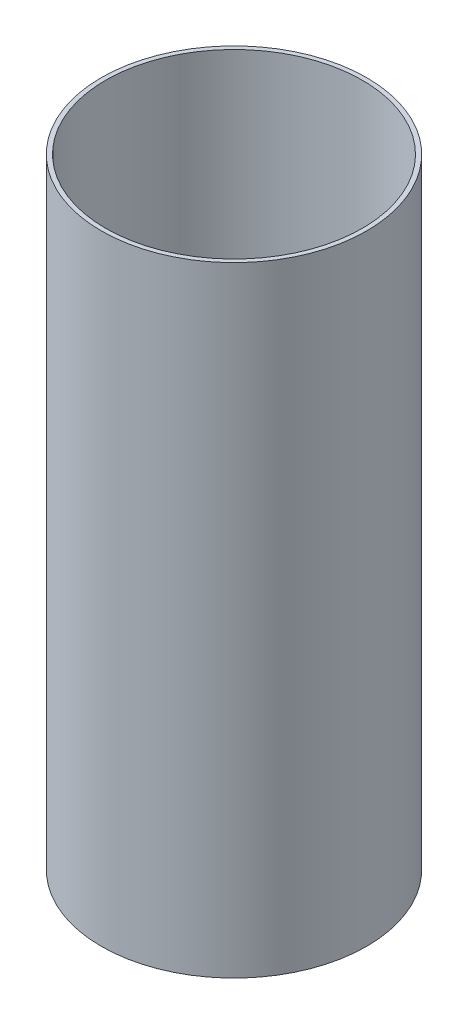
ISO-10303-21;
HEADER;
FILE_DESCRIPTION(('STEP AP214'),'2;1');
FILE_NAME('part.step','',(''),(''),'','','');
FILE_SCHEMA(('AUTOMOTIVE_DESIGN { 1 0 10303 214 1 1 1 1 }'));
ENDSEC;
DATA;
#1=APPLICATION_CONTEXT('core data for automotive mechanical design processes');
#2=APPLICATION_PROTOCOL_DEFINITION('international standard','automotive_design',2000,#1);
#3=PRODUCT_CONTEXT('',#1,'mechanical');
#4=PRODUCT('Part','Part','',(#3));
#5=PRODUCT_RELATED_PRODUCT_CATEGORY('part','',(#4));
#6=PRODUCT_DEFINITION_FORMATION('','',#4);
#7=PRODUCT_DEFINITION_CONTEXT('part definition',#1,'design');
#8=PRODUCT_DEFINITION('design','',#6,#7);
#9=PRODUCT_DEFINITION_SHAPE('','',#8);
#10=(LENGTH_UNIT() NAMED_UNIT(*) SI_UNIT(.MILLI.,.METRE.));
#11=(NAMED_UNIT(*) PLANE_ANGLE_UNIT() SI_UNIT($,.RADIAN.));
#12=(NAMED_UNIT(*) SI_UNIT($,.STERADIAN.) SOLID_ANGLE_UNIT());
#13=UNCERTAINTY_MEASURE_WITH_UNIT(LENGTH_MEASURE(1.E-05),#10,'distance_accuracy_value','');
#14=(GEOMETRIC_REPRESENTATION_CONTEXT(3) GLOBAL_UNCERTAINTY_ASSIGNED_CONTEXT((#13)) GLOBAL_UNIT_ASSIGNED_CONTEXT((#10,
#11,#12)) REPRESENTATION_CONTEXT('',''));
#15=CARTESIAN_POINT('',(0.,0.,0.));
#16=DIRECTION('',(0.,0.,1.));
#17=DIRECTION('',(1.,0.,0.));
#18=AXIS2_PLACEMENT_3D('',#15,#16,#17);
#19=CARTESIAN_POINT('',(0.,355.6,0.));
#20=DIRECTION('',(0.,1.,0.));
#21=DIRECTION('',(0.,0.,1.));
#22=AXIS2_PLACEMENT_3D('',#19,#20,#21);
#23=PLANE('',#22);
#24=CARTESIAN_POINT('',(0.,355.6,0.));
#25=DIRECTION('',(0.,1.,0.));
#26=DIRECTION('',(0.,0.,1.));
#27=AXIS2_PLACEMENT_3D('',#24,#25,#26);
#28=CIRCLE('',#27,76.1746);
#29=CARTESIAN_POINT('',(0.,355.6,76.1746));
#30=VERTEX_POINT('',#29);
#31=EDGE_CURVE('E10',#30,#30,#28,.T.);
#32=ORIENTED_EDGE('',*,*,#31,.T.);
#33=EDGE_LOOP('',(#32));
#34=FACE_BOUND('',#33,.T.);
#35=CARTESIAN_POINT('',(0.,355.6,0.));
#36=DIRECTION('',(0.,1.,0.));
#37=DIRECTION('',(0.,0.,1.));
#38=AXIS2_PLACEMENT_3D('',#35,#36,#37);
#39=CIRCLE('',#38,73.66);
#40=CARTESIAN_POINT('',(0.,355.6,73.66));
#41=VERTEX_POINT('',#40);
#42=EDGE_CURVE('E42',#41,#41,#39,.T.);
#43=ORIENTED_EDGE('',*,*,#42,.F.);
#44=EDGE_LOOP('',(#43));
#45=FACE_BOUND('',#44,.T.);
#46=ADVANCED_FACE('F31',(#34,#45),#23,.T.);
#47=CARTESIAN_POINT('',(0.,0.,0.));
#48=DIRECTION('',(0.,1.,0.));
#49=DIRECTION('',(0.,0.,1.));
#50=AXIS2_PLACEMENT_3D('',#47,#48,#49);
#51=PLANE('',#50);
#52=CARTESIAN_POINT('',(0.,0.,0.));
#53=DIRECTION('',(0.,1.,0.));
#54=DIRECTION('',(0.,0.,1.));
#55=AXIS2_PLACEMENT_3D('',#52,#53,#54);
#56=CIRCLE('',#55,76.1746);
#57=CARTESIAN_POINT('',(0.,0.,76.1746));
#58=VERTEX_POINT('',#57);
#59=EDGE_CURVE('E35',#58,#58,#56,.T.);
#60=ORIENTED_EDGE('',*,*,#59,.F.);
#61=EDGE_LOOP('',(#60));
#62=FACE_BOUND('',#61,.T.);
#63=CARTESIAN_POINT('',(0.,0.,0.));
#64=DIRECTION('',(0.,1.,0.));
#65=DIRECTION('',(0.,0.,1.));
#66=AXIS2_PLACEMENT_3D('',#63,#64,#65);
#67=CIRCLE('',#66,73.66);
#68=CARTESIAN_POINT('',(0.,0.,73.66));
#69=VERTEX_POINT('',#68);
#70=EDGE_CURVE('E44',#69,#69,#67,.T.);
#71=ORIENTED_EDGE('',*,*,#70,.T.);
#72=EDGE_LOOP('',(#71));
#73=FACE_BOUND('',#72,.T.);
#74=ADVANCED_FACE('F54',(#62,#73),#51,.F.);
#75=CARTESIAN_POINT('',(0.,355.6,0.));
#76=DIRECTION('',(0.,-1.,0.));
#77=DIRECTION('',(0.,0.,-1.));
#78=AXIS2_PLACEMENT_3D('',#75,#76,#77);
#79=CYLINDRICAL_SURFACE('',#78,76.1746);
#80=ORIENTED_EDGE('',*,*,#31,.F.);
#81=EDGE_LOOP('',(#80));
#82=FACE_BOUND('',#81,.T.);
#83=ORIENTED_EDGE('',*,*,#59,.T.);
#84=EDGE_LOOP('',(#83));
#85=FACE_BOUND('',#84,.T.);
#86=ADVANCED_FACE('F33',(#82,#85),#79,.T.);
#87=CARTESIAN_POINT('',(0.,355.6,0.));
#88=DIRECTION('',(0.,-1.,0.));
#89=DIRECTION('',(0.,0.,-1.));
#90=AXIS2_PLACEMENT_3D('',#87,#88,#89);
#91=CYLINDRICAL_SURFACE('',#90,73.66);
#92=ORIENTED_EDGE('',*,*,#42,.T.);
#93=EDGE_LOOP('',(#92));
#94=FACE_BOUND('',#93,.T.);
#95=ORIENTED_EDGE('',*,*,#70,.F.);
#96=EDGE_LOOP('',(#95));
#97=FACE_BOUND('',#96,.T.);
#98=ADVANCED_FACE('F50',(#94,#97),#91,.F.);
#99=CLOSED_SHELL('',(#46,#74,#86,#98));
#100=MANIFOLD_SOLID_BREP('B2',#99);
#101=ADVANCED_BREP_SHAPE_REPRESENTATION('',(#18,#100),#14);
#102=SHAPE_DEFINITION_REPRESENTATION(#9,#101);
ENDSEC;
END-ISO-10303-21;
